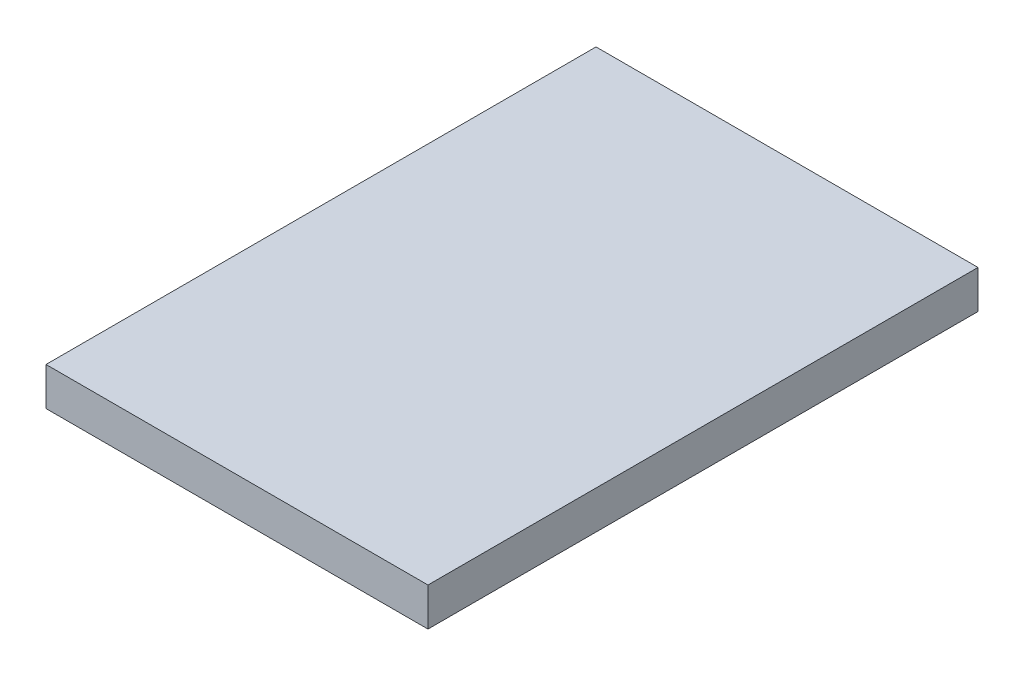
ISO-10303-21;
HEADER;
FILE_DESCRIPTION(('STEP AP214'),'2;1');
FILE_NAME('part.step','',(''),(''),'','','');
FILE_SCHEMA(('AUTOMOTIVE_DESIGN { 1 0 10303 214 1 1 1 1 }'));
ENDSEC;
DATA;
#1=APPLICATION_CONTEXT('core data for automotive mechanical design processes');
#2=APPLICATION_PROTOCOL_DEFINITION('international standard','automotive_design',2000,#1);
#3=PRODUCT_CONTEXT('',#1,'mechanical');
#4=PRODUCT('Part','Part','',(#3));
#5=PRODUCT_RELATED_PRODUCT_CATEGORY('part','',(#4));
#6=PRODUCT_DEFINITION_FORMATION('','',#4);
#7=PRODUCT_DEFINITION_CONTEXT('part definition',#1,'design');
#8=PRODUCT_DEFINITION('design','',#6,#7);
#9=PRODUCT_DEFINITION_SHAPE('','',#8);
#10=(LENGTH_UNIT() NAMED_UNIT(*) SI_UNIT(.MILLI.,.METRE.));
#11=(NAMED_UNIT(*) PLANE_ANGLE_UNIT() SI_UNIT($,.RADIAN.));
#12=(NAMED_UNIT(*) SI_UNIT($,.STERADIAN.) SOLID_ANGLE_UNIT());
#13=UNCERTAINTY_MEASURE_WITH_UNIT(LENGTH_MEASURE(1.E-05),#10,'distance_accuracy_value','');
#14=(GEOMETRIC_REPRESENTATION_CONTEXT(3) GLOBAL_UNCERTAINTY_ASSIGNED_CONTEXT((#13)) GLOBAL_UNIT_ASSIGNED_CONTEXT((#10,
#11,#12)) REPRESENTATION_CONTEXT('',''));
#15=CARTESIAN_POINT('',(0.,0.,0.));
#16=DIRECTION('',(0.,0.,1.));
#17=DIRECTION('',(1.,0.,0.));
#18=AXIS2_PLACEMENT_3D('',#15,#16,#17);
#19=CARTESIAN_POINT('',(0.,5.,0.));
#20=DIRECTION('',(1.,0.,0.));
#21=DIRECTION('',(0.,0.,-1.));
#22=AXIS2_PLACEMENT_3D('',#19,#20,#21);
#23=PLANE('',#22);
#24=DIRECTION('',(0.,0.,1.));
#25=VECTOR('',#24,1.);
#26=CARTESIAN_POINT('',(0.,0.,0.));
#27=LINE('',#26,#25);
#28=CARTESIAN_POINT('',(0.,0.,-72.));
#29=VERTEX_POINT('',#28);
#30=CARTESIAN_POINT('',(0.,0.,0.));
#31=VERTEX_POINT('',#30);
#32=EDGE_CURVE('E96',#29,#31,#27,.T.);
#33=ORIENTED_EDGE('',*,*,#32,.T.);
#34=DIRECTION('',(0.,-1.,0.));
#35=VECTOR('',#34,1.);
#36=CARTESIAN_POINT('',(0.,5.,0.));
#37=LINE('',#36,#35);
#38=CARTESIAN_POINT('',(0.,5.,0.));
#39=VERTEX_POINT('',#38);
#40=EDGE_CURVE('E11',#39,#31,#37,.T.);
#41=ORIENTED_EDGE('',*,*,#40,.F.);
#42=DIRECTION('',(0.,0.,1.));
#43=VECTOR('',#42,1.);
#44=CARTESIAN_POINT('',(0.,5.,0.));
#45=LINE('',#44,#43);
#46=CARTESIAN_POINT('',(0.,5.,-72.));
#47=VERTEX_POINT('',#46);
#48=EDGE_CURVE('E84',#47,#39,#45,.T.);
#49=ORIENTED_EDGE('',*,*,#48,.F.);
#50=DIRECTION('',(0.,-1.,0.));
#51=VECTOR('',#50,1.);
#52=CARTESIAN_POINT('',(0.,5.,-72.));
#53=LINE('',#52,#51);
#54=EDGE_CURVE('E92',#47,#29,#53,.T.);
#55=ORIENTED_EDGE('',*,*,#54,.T.);
#56=EDGE_LOOP('',(#33,#41,#49,#55));
#57=FACE_BOUND('',#56,.T.);
#58=ADVANCED_FACE('F33',(#57),#23,.F.);
#59=CARTESIAN_POINT('',(0.,5.,0.));
#60=DIRECTION('',(0.,0.,-1.));
#61=DIRECTION('',(-1.,0.,0.));
#62=AXIS2_PLACEMENT_3D('',#59,#60,#61);
#63=PLANE('',#62);
#64=DIRECTION('',(1.,0.,0.));
#65=VECTOR('',#64,1.);
#66=CARTESIAN_POINT('',(0.,0.,0.));
#67=LINE('',#66,#65);
#68=CARTESIAN_POINT('',(50.,0.,0.));
#69=VERTEX_POINT('',#68);
#70=EDGE_CURVE('E88',#31,#69,#67,.T.);
#71=ORIENTED_EDGE('',*,*,#70,.T.);
#72=DIRECTION('',(0.,-1.,0.));
#73=VECTOR('',#72,1.);
#74=CARTESIAN_POINT('',(50.,5.,0.));
#75=LINE('',#74,#73);
#76=CARTESIAN_POINT('',(50.,5.,0.));
#77=VERTEX_POINT('',#76);
#78=EDGE_CURVE('E41',#77,#69,#75,.T.);
#79=ORIENTED_EDGE('',*,*,#78,.F.);
#80=DIRECTION('',(1.,0.,0.));
#81=VECTOR('',#80,1.);
#82=CARTESIAN_POINT('',(0.,5.,0.));
#83=LINE('',#82,#81);
#84=EDGE_CURVE('E79',#39,#77,#83,.T.);
#85=ORIENTED_EDGE('',*,*,#84,.F.);
#86=ORIENTED_EDGE('',*,*,#40,.T.);
#87=EDGE_LOOP('',(#71,#79,#85,#86));
#88=FACE_BOUND('',#87,.T.);
#89=ADVANCED_FACE('F87',(#88),#63,.F.);
#90=CARTESIAN_POINT('',(50.,5.,0.));
#91=DIRECTION('',(-1.,0.,0.));
#92=DIRECTION('',(0.,0.,1.));
#93=AXIS2_PLACEMENT_3D('',#90,#91,#92);
#94=PLANE('',#93);
#95=DIRECTION('',(0.,0.,-1.));
#96=VECTOR('',#95,1.);
#97=CARTESIAN_POINT('',(50.,0.,0.));
#98=LINE('',#97,#96);
#99=CARTESIAN_POINT('',(50.,0.,-72.));
#100=VERTEX_POINT('',#99);
#101=EDGE_CURVE('E66',#69,#100,#98,.T.);
#102=ORIENTED_EDGE('',*,*,#101,.T.);
#103=DIRECTION('',(0.,-1.,0.));
#104=VECTOR('',#103,1.);
#105=CARTESIAN_POINT('',(50.,5.,-72.));
#106=LINE('',#105,#104);
#107=CARTESIAN_POINT('',(50.,5.,-72.));
#108=VERTEX_POINT('',#107);
#109=EDGE_CURVE('E89',#108,#100,#106,.T.);
#110=ORIENTED_EDGE('',*,*,#109,.F.);
#111=DIRECTION('',(0.,0.,-1.));
#112=VECTOR('',#111,1.);
#113=CARTESIAN_POINT('',(50.,5.,0.));
#114=LINE('',#113,#112);
#115=EDGE_CURVE('E82',#77,#108,#114,.T.);
#116=ORIENTED_EDGE('',*,*,#115,.F.);
#117=ORIENTED_EDGE('',*,*,#78,.T.);
#118=EDGE_LOOP('',(#102,#110,#116,#117));
#119=FACE_BOUND('',#118,.T.);
#120=ADVANCED_FACE('F90',(#119),#94,.F.);
#121=CARTESIAN_POINT('',(0.,5.,-72.));
#122=DIRECTION('',(0.,0.,1.));
#123=DIRECTION('',(1.,0.,0.));
#124=AXIS2_PLACEMENT_3D('',#121,#122,#123);
#125=PLANE('',#124);
#126=DIRECTION('',(-1.,0.,0.));
#127=VECTOR('',#126,1.);
#128=CARTESIAN_POINT('',(0.,0.,-72.));
#129=LINE('',#128,#127);
#130=EDGE_CURVE('E72',#100,#29,#129,.T.);
#131=ORIENTED_EDGE('',*,*,#130,.T.);
#132=ORIENTED_EDGE('',*,*,#54,.F.);
#133=DIRECTION('',(-1.,0.,0.));
#134=VECTOR('',#133,1.);
#135=CARTESIAN_POINT('',(0.,5.,-72.));
#136=LINE('',#135,#134);
#137=EDGE_CURVE('E49',#108,#47,#136,.T.);
#138=ORIENTED_EDGE('',*,*,#137,.F.);
#139=ORIENTED_EDGE('',*,*,#109,.T.);
#140=EDGE_LOOP('',(#131,#132,#138,#139));
#141=FACE_BOUND('',#140,.T.);
#142=ADVANCED_FACE('F103',(#141),#125,.F.);
#143=CARTESIAN_POINT('',(0.,5.,0.));
#144=DIRECTION('',(0.,-1.,0.));
#145=DIRECTION('',(0.,0.,-1.));
#146=AXIS2_PLACEMENT_3D('',#143,#144,#145);
#147=PLANE('',#146);
#148=ORIENTED_EDGE('',*,*,#48,.T.);
#149=ORIENTED_EDGE('',*,*,#84,.T.);
#150=ORIENTED_EDGE('',*,*,#115,.T.);
#151=ORIENTED_EDGE('',*,*,#137,.T.);
#152=EDGE_LOOP('',(#148,#149,#150,#151));
#153=FACE_BOUND('',#152,.T.);
#154=ADVANCED_FACE('F80',(#153),#147,.F.);
#155=CARTESIAN_POINT('',(0.,0.,0.));
#156=DIRECTION('',(0.,-1.,0.));
#157=DIRECTION('',(0.,0.,-1.));
#158=AXIS2_PLACEMENT_3D('',#155,#156,#157);
#159=PLANE('',#158);
#160=ORIENTED_EDGE('',*,*,#32,.F.);
#161=ORIENTED_EDGE('',*,*,#130,.F.);
#162=ORIENTED_EDGE('',*,*,#101,.F.);
#163=ORIENTED_EDGE('',*,*,#70,.F.);
#164=EDGE_LOOP('',(#160,#161,#162,#163));
#165=FACE_BOUND('',#164,.T.);
#166=ADVANCED_FACE('F106',(#165),#159,.T.);
#167=CLOSED_SHELL('',(#58,#89,#120,#142,#154,#166));
#168=MANIFOLD_SOLID_BREP('B2',#167);
#169=ADVANCED_BREP_SHAPE_REPRESENTATION('',(#18,#168),#14);
#170=SHAPE_DEFINITION_REPRESENTATION(#9,#169);
ENDSEC;
END-ISO-10303-21;
